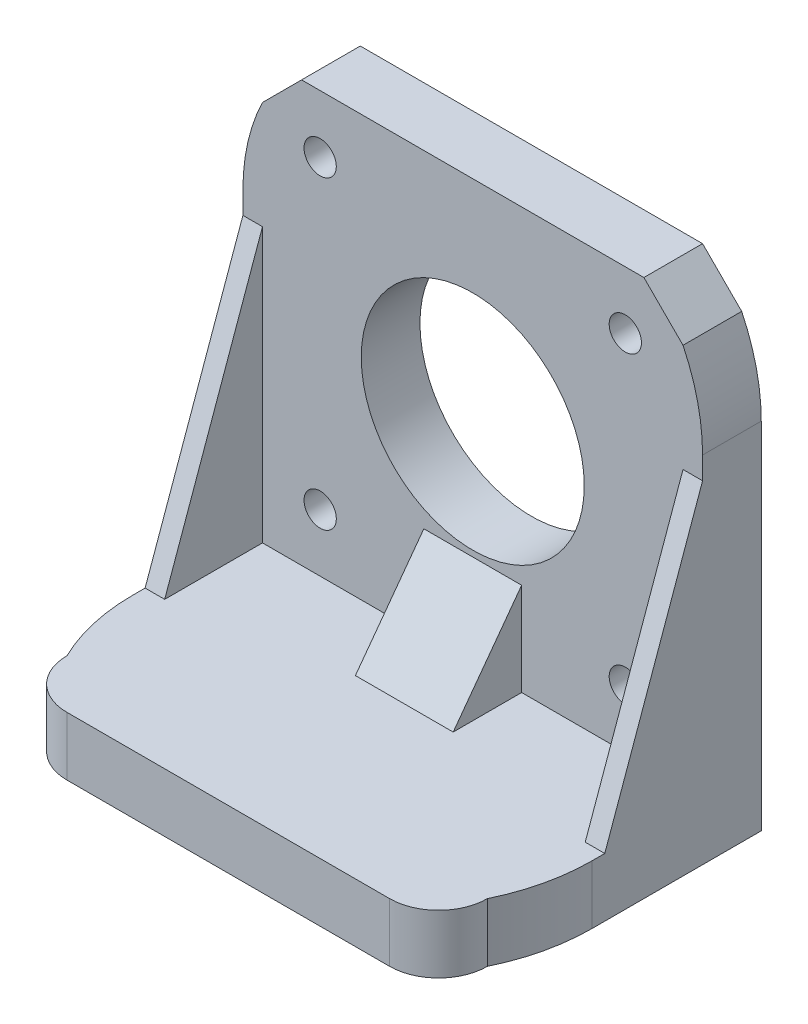
ISO-10303-21;
HEADER;
FILE_DESCRIPTION(('STEP AP214'),'2;1');
FILE_NAME('part.step','',(''),(''),'','','');
FILE_SCHEMA(('AUTOMOTIVE_DESIGN { 1 0 10303 214 1 1 1 1 }'));
ENDSEC;
DATA;
#1=APPLICATION_CONTEXT('core data for automotive mechanical design processes');
#2=APPLICATION_PROTOCOL_DEFINITION('international standard','automotive_design',2000,#1);
#3=PRODUCT_CONTEXT('',#1,'mechanical');
#4=PRODUCT('Part','Part','',(#3));
#5=PRODUCT_RELATED_PRODUCT_CATEGORY('part','',(#4));
#6=PRODUCT_DEFINITION_FORMATION('','',#4);
#7=PRODUCT_DEFINITION_CONTEXT('part definition',#1,'design');
#8=PRODUCT_DEFINITION('design','',#6,#7);
#9=PRODUCT_DEFINITION_SHAPE('','',#8);
#10=(LENGTH_UNIT() NAMED_UNIT(*) SI_UNIT(.MILLI.,.METRE.));
#11=(NAMED_UNIT(*) PLANE_ANGLE_UNIT() SI_UNIT($,.RADIAN.));
#12=(NAMED_UNIT(*) SI_UNIT($,.STERADIAN.) SOLID_ANGLE_UNIT());
#13=UNCERTAINTY_MEASURE_WITH_UNIT(LENGTH_MEASURE(1.E-05),#10,'distance_accuracy_value','');
#14=(GEOMETRIC_REPRESENTATION_CONTEXT(3) GLOBAL_UNCERTAINTY_ASSIGNED_CONTEXT((#13)) GLOBAL_UNIT_ASSIGNED_CONTEXT((#10,
#11,#12)) REPRESENTATION_CONTEXT('',''));
#15=CARTESIAN_POINT('',(0.,0.,0.));
#16=DIRECTION('',(0.,0.,1.));
#17=DIRECTION('',(1.,0.,0.));
#18=AXIS2_PLACEMENT_3D('',#15,#16,#17);
#19=CARTESIAN_POINT('',(0.,0.,6.));
#20=DIRECTION('',(0.,0.,-1.));
#21=DIRECTION('',(-1.,0.,0.));
#22=AXIS2_PLACEMENT_3D('',#19,#20,#21);
#23=PLANE('',#22);
#24=DIRECTION('',(-0.707106781186548,-0.707106781186548,0.));
#25=VECTOR('',#24,1.);
#26=CARTESIAN_POINT('',(-21.5,17.5,6.));
#27=LINE('',#26,#25);
#28=CARTESIAN_POINT('',(-17.5,21.5,6.));
#29=VERTEX_POINT('',#28);
#30=CARTESIAN_POINT('',(-21.5,17.5,6.));
#31=VERTEX_POINT('',#30);
#32=EDGE_CURVE('E326',#29,#31,#27,.T.);
#33=ORIENTED_EDGE('',*,*,#32,.T.);
#34=CARTESIAN_POINT('',(-3.5,8.78220211291863,6.));
#35=DIRECTION('',(0.,0.,-1.));
#36=DIRECTION('',(-1.,0.,0.));
#37=AXIS2_PLACEMENT_3D('',#34,#35,#36);
#38=CIRCLE('',#37,20.);
#39=CARTESIAN_POINT('',(-23.5,8.78220211291863,6.));
#40=VERTEX_POINT('',#39);
#41=EDGE_CURVE('E360',#31,#40,#38,.F.);
#42=ORIENTED_EDGE('',*,*,#41,.T.);
#43=DIRECTION('',(0.,-1.,0.));
#44=VECTOR('',#43,1.);
#45=CARTESIAN_POINT('',(-23.5,0.,6.));
#46=LINE('',#45,#44);
#47=CARTESIAN_POINT('',(-23.5,6.5,6.));
#48=VERTEX_POINT('',#47);
#49=EDGE_CURVE('E199',#40,#48,#46,.T.);
#50=ORIENTED_EDGE('',*,*,#49,.T.);
#51=DIRECTION('',(1.,0.,0.));
#52=VECTOR('',#51,1.);
#53=CARTESIAN_POINT('',(-23.5,6.5,6.));
#54=LINE('',#53,#52);
#55=CARTESIAN_POINT('',(-21.5,6.5,6.));
#56=VERTEX_POINT('',#55);
#57=EDGE_CURVE('E208',#48,#56,#54,.T.);
#58=ORIENTED_EDGE('',*,*,#57,.T.);
#59=DIRECTION('',(0.,1.,0.));
#60=VECTOR('',#59,1.);
#61=CARTESIAN_POINT('',(-21.5,0.,6.));
#62=LINE('',#61,#60);
#63=CARTESIAN_POINT('',(-21.5,-21.5,6.));
#64=VERTEX_POINT('',#63);
#65=EDGE_CURVE('E218',#64,#56,#62,.T.);
#66=ORIENTED_EDGE('',*,*,#65,.F.);
#67=DIRECTION('',(1.,0.,0.));
#68=VECTOR('',#67,1.);
#69=CARTESIAN_POINT('',(-21.5,-21.5,6.));
#70=LINE('',#69,#68);
#71=CARTESIAN_POINT('',(-5.,-21.5,6.));
#72=VERTEX_POINT('',#71);
#73=EDGE_CURVE('E315',#64,#72,#70,.T.);
#74=ORIENTED_EDGE('',*,*,#73,.T.);
#75=DIRECTION('',(0.,-1.,0.));
#76=VECTOR('',#75,1.);
#77=CARTESIAN_POINT('',(-5.,0.,6.));
#78=LINE('',#77,#76);
#79=CARTESIAN_POINT('',(-5.,-12.,6.));
#80=VERTEX_POINT('',#79);
#81=EDGE_CURVE('E248',#80,#72,#78,.T.);
#82=ORIENTED_EDGE('',*,*,#81,.F.);
#83=DIRECTION('',(1.,0.,0.));
#84=VECTOR('',#83,1.);
#85=CARTESIAN_POINT('',(0.,-12.,6.));
#86=LINE('',#85,#84);
#87=CARTESIAN_POINT('',(5.,-12.,6.));
#88=VERTEX_POINT('',#87);
#89=EDGE_CURVE('E257',#80,#88,#86,.T.);
#90=ORIENTED_EDGE('',*,*,#89,.T.);
#91=DIRECTION('',(0.,-1.,0.));
#92=VECTOR('',#91,1.);
#93=CARTESIAN_POINT('',(5.,0.,6.));
#94=LINE('',#93,#92);
#95=CARTESIAN_POINT('',(5.,-21.5,6.));
#96=VERTEX_POINT('',#95);
#97=EDGE_CURVE('E253',#88,#96,#94,.T.);
#98=ORIENTED_EDGE('',*,*,#97,.T.);
#99=CARTESIAN_POINT('',(21.5,-21.5,6.));
#100=VERTEX_POINT('',#99);
#101=EDGE_CURVE('E319',#96,#100,#70,.T.);
#102=ORIENTED_EDGE('',*,*,#101,.T.);
#103=DIRECTION('',(0.,1.,0.));
#104=VECTOR('',#103,1.);
#105=CARTESIAN_POINT('',(21.5,-21.5,6.));
#106=LINE('',#105,#104);
#107=CARTESIAN_POINT('',(21.5,6.5,6.));
#108=VERTEX_POINT('',#107);
#109=EDGE_CURVE('E318',#100,#108,#106,.T.);
#110=ORIENTED_EDGE('',*,*,#109,.T.);
#111=DIRECTION('',(-1.,0.,0.));
#112=VECTOR('',#111,1.);
#113=CARTESIAN_POINT('',(23.5,6.5,6.));
#114=LINE('',#113,#112);
#115=CARTESIAN_POINT('',(23.5,6.5,6.));
#116=VERTEX_POINT('',#115);
#117=EDGE_CURVE('E236',#116,#108,#114,.T.);
#118=ORIENTED_EDGE('',*,*,#117,.F.);
#119=DIRECTION('',(0.,-1.,0.));
#120=VECTOR('',#119,1.);
#121=CARTESIAN_POINT('',(23.5,0.,6.));
#122=LINE('',#121,#120);
#123=CARTESIAN_POINT('',(23.5,8.78220211291865,6.));
#124=VERTEX_POINT('',#123);
#125=EDGE_CURVE('E221',#124,#116,#122,.T.);
#126=ORIENTED_EDGE('',*,*,#125,.F.);
#127=CARTESIAN_POINT('',(3.5,8.78220211291865,6.));
#128=DIRECTION('',(0.,0.,-1.));
#129=DIRECTION('',(-1.,0.,0.));
#130=AXIS2_PLACEMENT_3D('',#127,#128,#129);
#131=CIRCLE('',#130,20.);
#132=CARTESIAN_POINT('',(21.5,17.5,6.));
#133=VERTEX_POINT('',#132);
#134=EDGE_CURVE('E352',#124,#133,#131,.F.);
#135=ORIENTED_EDGE('',*,*,#134,.T.);
#136=DIRECTION('',(-0.707106781186548,0.707106781186548,0.));
#137=VECTOR('',#136,1.);
#138=CARTESIAN_POINT('',(17.5,21.5,6.));
#139=LINE('',#138,#137);
#140=CARTESIAN_POINT('',(17.5,21.5,6.));
#141=VERTEX_POINT('',#140);
#142=EDGE_CURVE('E322',#133,#141,#139,.T.);
#143=ORIENTED_EDGE('',*,*,#142,.T.);
#144=DIRECTION('',(-1.,0.,0.));
#145=VECTOR('',#144,1.);
#146=CARTESIAN_POINT('',(-17.5,21.5,6.));
#147=LINE('',#146,#145);
#148=EDGE_CURVE('E324',#141,#29,#147,.T.);
#149=ORIENTED_EDGE('',*,*,#148,.T.);
#150=EDGE_LOOP('',(#33,#42,#50,#58,#66,#74,#82,#90,#98,#102,#110,#118,#126,#135,#143,#149));
#151=FACE_BOUND('',#150,.T.);
#152=CARTESIAN_POINT('',(-15.6,15.6,6.));
#153=DIRECTION('',(0.,0.,1.));
#154=DIRECTION('',(1.,0.,0.));
#155=AXIS2_PLACEMENT_3D('',#152,#153,#154);
#156=CIRCLE('',#155,1.65);
#157=CARTESIAN_POINT('',(-13.95,15.6,6.));
#158=VERTEX_POINT('',#157);
#159=EDGE_CURVE('E309',#158,#158,#156,.T.);
#160=ORIENTED_EDGE('',*,*,#159,.F.);
#161=EDGE_LOOP('',(#160));
#162=FACE_BOUND('',#161,.T.);
#163=CARTESIAN_POINT('',(-15.6,-15.6,6.));
#164=DIRECTION('',(0.,0.,1.));
#165=DIRECTION('',(1.,0.,0.));
#166=AXIS2_PLACEMENT_3D('',#163,#164,#165);
#167=CIRCLE('',#166,1.65);
#168=CARTESIAN_POINT('',(-13.95,-15.6,6.));
#169=VERTEX_POINT('',#168);
#170=EDGE_CURVE('E303',#169,#169,#167,.T.);
#171=ORIENTED_EDGE('',*,*,#170,.F.);
#172=EDGE_LOOP('',(#171));
#173=FACE_BOUND('',#172,.T.);
#174=CARTESIAN_POINT('',(15.6,-15.6,6.));
#175=DIRECTION('',(0.,0.,1.));
#176=DIRECTION('',(-1.,0.,0.));
#177=AXIS2_PLACEMENT_3D('',#174,#175,#176);
#178=CIRCLE('',#177,1.65);
#179=CARTESIAN_POINT('',(13.95,-15.6,6.));
#180=VERTEX_POINT('',#179);
#181=EDGE_CURVE('E297',#180,#180,#178,.T.);
#182=ORIENTED_EDGE('',*,*,#181,.F.);
#183=EDGE_LOOP('',(#182));
#184=FACE_BOUND('',#183,.T.);
#185=CARTESIAN_POINT('',(15.6,15.6,6.));
#186=DIRECTION('',(0.,0.,1.));
#187=DIRECTION('',(-1.,0.,0.));
#188=AXIS2_PLACEMENT_3D('',#185,#186,#187);
#189=CIRCLE('',#188,1.65);
#190=CARTESIAN_POINT('',(13.95,15.6,6.));
#191=VERTEX_POINT('',#190);
#192=EDGE_CURVE('E291',#191,#191,#189,.T.);
#193=ORIENTED_EDGE('',*,*,#192,.F.);
#194=EDGE_LOOP('',(#193));
#195=FACE_BOUND('',#194,.T.);
#196=CARTESIAN_POINT('',(0.,0.,6.));
#197=DIRECTION('',(0.,0.,1.));
#198=DIRECTION('',(1.,0.,0.));
#199=AXIS2_PLACEMENT_3D('',#196,#197,#198);
#200=CIRCLE('',#199,11.4);
#201=CARTESIAN_POINT('',(11.4,0.,6.));
#202=VERTEX_POINT('',#201);
#203=EDGE_CURVE('E285',#202,#202,#200,.T.);
#204=ORIENTED_EDGE('',*,*,#203,.F.);
#205=EDGE_LOOP('',(#204));
#206=FACE_BOUND('',#205,.T.);
#207=ADVANCED_FACE('F35',(#151,#162,#173,#184,#195,#206),#23,.F.);
#208=CARTESIAN_POINT('',(0.,0.,0.));
#209=DIRECTION('',(0.,0.,-1.));
#210=DIRECTION('',(-1.,0.,0.));
#211=AXIS2_PLACEMENT_3D('',#208,#209,#210);
#212=PLANE('',#211);
#213=DIRECTION('',(0.,1.,0.));
#214=VECTOR('',#213,1.);
#215=CARTESIAN_POINT('',(-23.5,0.,0.));
#216=LINE('',#215,#214);
#217=CARTESIAN_POINT('',(-23.5,-27.5,0.));
#218=VERTEX_POINT('',#217);
#219=CARTESIAN_POINT('',(-23.5,8.78220211291863,0.));
#220=VERTEX_POINT('',#219);
#221=EDGE_CURVE('E183',#218,#220,#216,.T.);
#222=ORIENTED_EDGE('',*,*,#221,.T.);
#223=CARTESIAN_POINT('',(-3.5,8.78220211291863,0.));
#224=DIRECTION('',(0.,0.,-1.));
#225=DIRECTION('',(-1.,0.,0.));
#226=AXIS2_PLACEMENT_3D('',#223,#224,#225);
#227=CIRCLE('',#226,20.);
#228=CARTESIAN_POINT('',(-21.5,17.5,0.));
#229=VERTEX_POINT('',#228);
#230=EDGE_CURVE('E364',#220,#229,#227,.T.);
#231=ORIENTED_EDGE('',*,*,#230,.T.);
#232=DIRECTION('',(-0.707106781186548,-0.707106781186548,0.));
#233=VECTOR('',#232,1.);
#234=CARTESIAN_POINT('',(-21.5,17.5,0.));
#235=LINE('',#234,#233);
#236=CARTESIAN_POINT('',(-17.5,21.5,0.));
#237=VERTEX_POINT('',#236);
#238=EDGE_CURVE('E333',#237,#229,#235,.T.);
#239=ORIENTED_EDGE('',*,*,#238,.F.);
#240=DIRECTION('',(-1.,0.,0.));
#241=VECTOR('',#240,1.);
#242=CARTESIAN_POINT('',(-17.5,21.5,0.));
#243=LINE('',#242,#241);
#244=CARTESIAN_POINT('',(17.5,21.5,0.));
#245=VERTEX_POINT('',#244);
#246=EDGE_CURVE('E331',#245,#237,#243,.T.);
#247=ORIENTED_EDGE('',*,*,#246,.F.);
#248=DIRECTION('',(-0.707106781186548,0.707106781186548,0.));
#249=VECTOR('',#248,1.);
#250=CARTESIAN_POINT('',(17.5,21.5,0.));
#251=LINE('',#250,#249);
#252=CARTESIAN_POINT('',(21.5,17.5,0.));
#253=VERTEX_POINT('',#252);
#254=EDGE_CURVE('E312',#253,#245,#251,.T.);
#255=ORIENTED_EDGE('',*,*,#254,.F.);
#256=CARTESIAN_POINT('',(3.5,8.78220211291865,0.));
#257=DIRECTION('',(0.,0.,-1.));
#258=DIRECTION('',(-1.,0.,0.));
#259=AXIS2_PLACEMENT_3D('',#256,#257,#258);
#260=CIRCLE('',#259,20.);
#261=CARTESIAN_POINT('',(23.5,8.78220211291865,0.));
#262=VERTEX_POINT('',#261);
#263=EDGE_CURVE('E354',#253,#262,#260,.T.);
#264=ORIENTED_EDGE('',*,*,#263,.T.);
#265=DIRECTION('',(0.,1.,0.));
#266=VECTOR('',#265,1.);
#267=CARTESIAN_POINT('',(23.5,0.,0.));
#268=LINE('',#267,#266);
#269=CARTESIAN_POINT('',(23.5,-27.5,0.));
#270=VERTEX_POINT('',#269);
#271=EDGE_CURVE('E191',#270,#262,#268,.T.);
#272=ORIENTED_EDGE('',*,*,#271,.F.);
#273=DIRECTION('',(1.,0.,0.));
#274=VECTOR('',#273,1.);
#275=CARTESIAN_POINT('',(-21.5,-27.5,0.));
#276=LINE('',#275,#274);
#277=EDGE_CURVE('E179',#218,#270,#276,.T.);
#278=ORIENTED_EDGE('',*,*,#277,.F.);
#279=EDGE_LOOP('',(#222,#231,#239,#247,#255,#264,#272,#278));
#280=FACE_BOUND('',#279,.T.);
#281=CARTESIAN_POINT('',(0.,0.,0.));
#282=DIRECTION('',(0.,0.,1.));
#283=DIRECTION('',(1.,0.,0.));
#284=AXIS2_PLACEMENT_3D('',#281,#282,#283);
#285=CIRCLE('',#284,11.4);
#286=CARTESIAN_POINT('',(11.4,0.,0.));
#287=VERTEX_POINT('',#286);
#288=EDGE_CURVE('E284',#287,#287,#285,.T.);
#289=ORIENTED_EDGE('',*,*,#288,.T.);
#290=EDGE_LOOP('',(#289));
#291=FACE_BOUND('',#290,.T.);
#292=CARTESIAN_POINT('',(15.6,15.6,0.));
#293=DIRECTION('',(0.,0.,1.));
#294=DIRECTION('',(-1.,0.,0.));
#295=AXIS2_PLACEMENT_3D('',#292,#293,#294);
#296=CIRCLE('',#295,1.65);
#297=CARTESIAN_POINT('',(13.95,15.6,0.));
#298=VERTEX_POINT('',#297);
#299=EDGE_CURVE('E288',#298,#298,#296,.T.);
#300=ORIENTED_EDGE('',*,*,#299,.T.);
#301=EDGE_LOOP('',(#300));
#302=FACE_BOUND('',#301,.T.);
#303=CARTESIAN_POINT('',(-15.6,-15.6,0.));
#304=DIRECTION('',(0.,0.,1.));
#305=DIRECTION('',(1.,0.,0.));
#306=AXIS2_PLACEMENT_3D('',#303,#304,#305);
#307=CIRCLE('',#306,1.65);
#308=CARTESIAN_POINT('',(-13.95,-15.6,0.));
#309=VERTEX_POINT('',#308);
#310=EDGE_CURVE('E300',#309,#309,#307,.T.);
#311=ORIENTED_EDGE('',*,*,#310,.T.);
#312=EDGE_LOOP('',(#311));
#313=FACE_BOUND('',#312,.T.);
#314=CARTESIAN_POINT('',(-15.6,15.6,0.));
#315=DIRECTION('',(0.,0.,1.));
#316=DIRECTION('',(1.,0.,0.));
#317=AXIS2_PLACEMENT_3D('',#314,#315,#316);
#318=CIRCLE('',#317,1.65);
#319=CARTESIAN_POINT('',(-13.95,15.6,0.));
#320=VERTEX_POINT('',#319);
#321=EDGE_CURVE('E306',#320,#320,#318,.T.);
#322=ORIENTED_EDGE('',*,*,#321,.T.);
#323=EDGE_LOOP('',(#322));
#324=FACE_BOUND('',#323,.T.);
#325=CARTESIAN_POINT('',(15.6,-15.6,0.));
#326=DIRECTION('',(0.,0.,1.));
#327=DIRECTION('',(-1.,0.,0.));
#328=AXIS2_PLACEMENT_3D('',#325,#326,#327);
#329=CIRCLE('',#328,1.65);
#330=CARTESIAN_POINT('',(13.95,-15.6,0.));
#331=VERTEX_POINT('',#330);
#332=EDGE_CURVE('E294',#331,#331,#329,.T.);
#333=ORIENTED_EDGE('',*,*,#332,.T.);
#334=EDGE_LOOP('',(#333));
#335=FACE_BOUND('',#334,.T.);
#336=ADVANCED_FACE('F187',(#280,#291,#302,#313,#324,#335),#212,.T.);
#337=CARTESIAN_POINT('',(17.5,21.5,6.));
#338=DIRECTION('',(-0.707106781186547,-0.707106781186547,0.));
#339=DIRECTION('',(0.707106781186548,-0.707106781186548,0.));
#340=AXIS2_PLACEMENT_3D('',#337,#338,#339);
#341=PLANE('',#340);
#342=ORIENTED_EDGE('',*,*,#254,.T.);
#343=DIRECTION('',(0.,0.,-1.));
#344=VECTOR('',#343,1.);
#345=CARTESIAN_POINT('',(17.5,21.5,6.));
#346=LINE('',#345,#344);
#347=EDGE_CURVE('E341',#141,#245,#346,.T.);
#348=ORIENTED_EDGE('',*,*,#347,.F.);
#349=ORIENTED_EDGE('',*,*,#142,.F.);
#350=DIRECTION('',(0.,0.,-1.));
#351=VECTOR('',#350,1.);
#352=CARTESIAN_POINT('',(21.5,17.5,6.));
#353=LINE('',#352,#351);
#354=EDGE_CURVE('E344',#133,#253,#353,.T.);
#355=ORIENTED_EDGE('',*,*,#354,.T.);
#356=EDGE_LOOP('',(#342,#348,#349,#355));
#357=FACE_BOUND('',#356,.T.);
#358=ADVANCED_FACE('F459',(#357),#341,.F.);
#359=CARTESIAN_POINT('',(-17.5,21.5,6.));
#360=DIRECTION('',(0.,-1.,0.));
#361=DIRECTION('',(0.,0.,-1.));
#362=AXIS2_PLACEMENT_3D('',#359,#360,#361);
#363=PLANE('',#362);
#364=ORIENTED_EDGE('',*,*,#246,.T.);
#365=DIRECTION('',(0.,0.,-1.));
#366=VECTOR('',#365,1.);
#367=CARTESIAN_POINT('',(-17.5,21.5,6.));
#368=LINE('',#367,#366);
#369=EDGE_CURVE('E338',#29,#237,#368,.T.);
#370=ORIENTED_EDGE('',*,*,#369,.F.);
#371=ORIENTED_EDGE('',*,*,#148,.F.);
#372=ORIENTED_EDGE('',*,*,#347,.T.);
#373=EDGE_LOOP('',(#364,#370,#371,#372));
#374=FACE_BOUND('',#373,.T.);
#375=ADVANCED_FACE('F380',(#374),#363,.F.);
#376=CARTESIAN_POINT('',(-21.5,17.5,6.));
#377=DIRECTION('',(0.707106781186547,-0.707106781186547,0.));
#378=DIRECTION('',(0.707106781186548,0.707106781186548,0.));
#379=AXIS2_PLACEMENT_3D('',#376,#377,#378);
#380=PLANE('',#379);
#381=ORIENTED_EDGE('',*,*,#238,.T.);
#382=DIRECTION('',(0.,0.,-1.));
#383=VECTOR('',#382,1.);
#384=CARTESIAN_POINT('',(-21.5,17.5,6.));
#385=LINE('',#384,#383);
#386=EDGE_CURVE('E329',#31,#229,#385,.T.);
#387=ORIENTED_EDGE('',*,*,#386,.F.);
#388=ORIENTED_EDGE('',*,*,#32,.F.);
#389=ORIENTED_EDGE('',*,*,#369,.T.);
#390=EDGE_LOOP('',(#381,#387,#388,#389));
#391=FACE_BOUND('',#390,.T.);
#392=ADVANCED_FACE('F370',(#391),#380,.F.);
#393=CARTESIAN_POINT('',(-15.6,15.6,6.));
#394=DIRECTION('',(0.,0.,-1.));
#395=DIRECTION('',(-1.,0.,0.));
#396=AXIS2_PLACEMENT_3D('',#393,#394,#395);
#397=CYLINDRICAL_SURFACE('',#396,1.65);
#398=ORIENTED_EDGE('',*,*,#159,.T.);
#399=EDGE_LOOP('',(#398));
#400=FACE_BOUND('',#399,.T.);
#401=ORIENTED_EDGE('',*,*,#321,.F.);
#402=EDGE_LOOP('',(#401));
#403=FACE_BOUND('',#402,.T.);
#404=ADVANCED_FACE('F462',(#400,#403),#397,.F.);
#405=CARTESIAN_POINT('',(-15.6,-15.6,6.));
#406=DIRECTION('',(0.,0.,-1.));
#407=DIRECTION('',(-1.,0.,0.));
#408=AXIS2_PLACEMENT_3D('',#405,#406,#407);
#409=CYLINDRICAL_SURFACE('',#408,1.65);
#410=ORIENTED_EDGE('',*,*,#170,.T.);
#411=EDGE_LOOP('',(#410));
#412=FACE_BOUND('',#411,.T.);
#413=ORIENTED_EDGE('',*,*,#310,.F.);
#414=EDGE_LOOP('',(#413));
#415=FACE_BOUND('',#414,.T.);
#416=ADVANCED_FACE('F717',(#412,#415),#409,.F.);
#417=CARTESIAN_POINT('',(15.6,-15.6,6.));
#418=DIRECTION('',(0.,0.,-1.));
#419=DIRECTION('',(-1.,0.,0.));
#420=AXIS2_PLACEMENT_3D('',#417,#418,#419);
#421=CYLINDRICAL_SURFACE('',#420,1.65);
#422=ORIENTED_EDGE('',*,*,#181,.T.);
#423=EDGE_LOOP('',(#422));
#424=FACE_BOUND('',#423,.T.);
#425=ORIENTED_EDGE('',*,*,#332,.F.);
#426=EDGE_LOOP('',(#425));
#427=FACE_BOUND('',#426,.T.);
#428=ADVANCED_FACE('F714',(#424,#427),#421,.F.);
#429=CARTESIAN_POINT('',(15.6,15.6,6.));
#430=DIRECTION('',(0.,0.,-1.));
#431=DIRECTION('',(-1.,0.,0.));
#432=AXIS2_PLACEMENT_3D('',#429,#430,#431);
#433=CYLINDRICAL_SURFACE('',#432,1.65);
#434=ORIENTED_EDGE('',*,*,#192,.T.);
#435=EDGE_LOOP('',(#434));
#436=FACE_BOUND('',#435,.T.);
#437=ORIENTED_EDGE('',*,*,#299,.F.);
#438=EDGE_LOOP('',(#437));
#439=FACE_BOUND('',#438,.T.);
#440=ADVANCED_FACE('F669',(#436,#439),#433,.F.);
#441=CARTESIAN_POINT('',(0.,0.,6.));
#442=DIRECTION('',(0.,0.,-1.));
#443=DIRECTION('',(-1.,0.,0.));
#444=AXIS2_PLACEMENT_3D('',#441,#442,#443);
#445=CYLINDRICAL_SURFACE('',#444,11.4);
#446=ORIENTED_EDGE('',*,*,#288,.F.);
#447=EDGE_LOOP('',(#446));
#448=FACE_BOUND('',#447,.T.);
#449=ORIENTED_EDGE('',*,*,#203,.T.);
#450=EDGE_LOOP('',(#449));
#451=FACE_BOUND('',#450,.T.);
#452=ADVANCED_FACE('F564',(#448,#451),#445,.F.);
#453=CARTESIAN_POINT('',(-16.5,-21.5,26.));
#454=DIRECTION('',(0.,1.,0.));
#455=DIRECTION('',(0.,0.,1.));
#456=AXIS2_PLACEMENT_3D('',#453,#454,#455);
#457=PLANE('',#456);
#458=DIRECTION('',(0.,0.,1.));
#459=VECTOR('',#458,1.);
#460=CARTESIAN_POINT('',(-23.5,-21.5,0.));
#461=LINE('',#460,#459);
#462=CARTESIAN_POINT('',(-23.5,-21.5,16.));
#463=VERTEX_POINT('',#462);
#464=CARTESIAN_POINT('',(-23.5,-21.5,17.2822021129186));
#465=VERTEX_POINT('',#464);
#466=EDGE_CURVE('E182',#463,#465,#461,.T.);
#467=ORIENTED_EDGE('',*,*,#466,.T.);
#468=CARTESIAN_POINT('',(-3.5,-21.5,17.2822021129186));
#469=DIRECTION('',(0.,1.,0.));
#470=DIRECTION('',(0.,0.,1.));
#471=AXIS2_PLACEMENT_3D('',#468,#469,#470);
#472=CIRCLE('',#471,20.);
#473=CARTESIAN_POINT('',(-21.5,-21.5,26.));
#474=VERTEX_POINT('',#473);
#475=EDGE_CURVE('E11',#465,#474,#472,.T.);
#476=ORIENTED_EDGE('',*,*,#475,.T.);
#477=CARTESIAN_POINT('',(-16.5,-21.5,26.));
#478=DIRECTION('',(0.,-1.,0.));
#479=DIRECTION('',(0.,0.,1.));
#480=AXIS2_PLACEMENT_3D('',#477,#478,#479);
#481=CIRCLE('',#480,5.);
#482=CARTESIAN_POINT('',(-16.5,-21.5,31.));
#483=VERTEX_POINT('',#482);
#484=EDGE_CURVE('E193',#483,#474,#481,.T.);
#485=ORIENTED_EDGE('',*,*,#484,.F.);
#486=DIRECTION('',(-1.,0.,0.));
#487=VECTOR('',#486,1.);
#488=CARTESIAN_POINT('',(-16.5,-21.5,31.));
#489=LINE('',#488,#487);
#490=CARTESIAN_POINT('',(16.5,-21.5,31.));
#491=VERTEX_POINT('',#490);
#492=EDGE_CURVE('E270',#491,#483,#489,.T.);
#493=ORIENTED_EDGE('',*,*,#492,.F.);
#494=CARTESIAN_POINT('',(16.5,-21.5,26.));
#495=DIRECTION('',(0.,-1.,0.));
#496=DIRECTION('',(0.,0.,1.));
#497=AXIS2_PLACEMENT_3D('',#494,#495,#496);
#498=CIRCLE('',#497,5.);
#499=CARTESIAN_POINT('',(21.5,-21.5,26.));
#500=VERTEX_POINT('',#499);
#501=EDGE_CURVE('E268',#500,#491,#498,.T.);
#502=ORIENTED_EDGE('',*,*,#501,.F.);
#503=CARTESIAN_POINT('',(3.5,-21.5,17.2822021129186));
#504=DIRECTION('',(0.,1.,0.));
#505=DIRECTION('',(0.,0.,1.));
#506=AXIS2_PLACEMENT_3D('',#503,#504,#505);
#507=CIRCLE('',#506,20.);
#508=CARTESIAN_POINT('',(23.5,-21.5,17.2822021129186));
#509=VERTEX_POINT('',#508);
#510=EDGE_CURVE('E358',#500,#509,#507,.T.);
#511=ORIENTED_EDGE('',*,*,#510,.T.);
#512=DIRECTION('',(0.,0.,1.));
#513=VECTOR('',#512,1.);
#514=CARTESIAN_POINT('',(23.5,-21.5,0.));
#515=LINE('',#514,#513);
#516=CARTESIAN_POINT('',(23.5,-21.5,16.));
#517=VERTEX_POINT('',#516);
#518=EDGE_CURVE('E225',#517,#509,#515,.T.);
#519=ORIENTED_EDGE('',*,*,#518,.F.);
#520=DIRECTION('',(-1.,0.,0.));
#521=VECTOR('',#520,1.);
#522=CARTESIAN_POINT('',(23.5,-21.5,16.));
#523=LINE('',#522,#521);
#524=CARTESIAN_POINT('',(21.5,-21.5,16.));
#525=VERTEX_POINT('',#524);
#526=EDGE_CURVE('E231',#517,#525,#523,.T.);
#527=ORIENTED_EDGE('',*,*,#526,.T.);
#528=DIRECTION('',(0.,0.,1.));
#529=VECTOR('',#528,1.);
#530=CARTESIAN_POINT('',(21.5,-21.5,0.));
#531=LINE('',#530,#529);
#532=EDGE_CURVE('E259',#100,#525,#531,.T.);
#533=ORIENTED_EDGE('',*,*,#532,.F.);
#534=ORIENTED_EDGE('',*,*,#101,.F.);
#535=DIRECTION('',(0.,0.,-1.));
#536=VECTOR('',#535,1.);
#537=CARTESIAN_POINT('',(5.,-21.5,26.));
#538=LINE('',#537,#536);
#539=CARTESIAN_POINT('',(5.,-21.5,13.));
#540=VERTEX_POINT('',#539);
#541=EDGE_CURVE('E250',#540,#96,#538,.T.);
#542=ORIENTED_EDGE('',*,*,#541,.F.);
#543=DIRECTION('',(1.,0.,0.));
#544=VECTOR('',#543,1.);
#545=CARTESIAN_POINT('',(-16.5,-21.5,13.));
#546=LINE('',#545,#544);
#547=CARTESIAN_POINT('',(-5.,-21.5,13.));
#548=VERTEX_POINT('',#547);
#549=EDGE_CURVE('E255',#548,#540,#546,.T.);
#550=ORIENTED_EDGE('',*,*,#549,.F.);
#551=DIRECTION('',(0.,0.,-1.));
#552=VECTOR('',#551,1.);
#553=CARTESIAN_POINT('',(-5.,-21.5,26.));
#554=LINE('',#553,#552);
#555=EDGE_CURVE('E243',#548,#72,#554,.T.);
#556=ORIENTED_EDGE('',*,*,#555,.T.);
#557=ORIENTED_EDGE('',*,*,#73,.F.);
#558=DIRECTION('',(0.,0.,1.));
#559=VECTOR('',#558,1.);
#560=CARTESIAN_POINT('',(-21.5,-21.5,26.));
#561=LINE('',#560,#559);
#562=CARTESIAN_POINT('',(-21.5,-21.5,16.));
#563=VERTEX_POINT('',#562);
#564=EDGE_CURVE('E215',#64,#563,#561,.T.);
#565=ORIENTED_EDGE('',*,*,#564,.T.);
#566=DIRECTION('',(1.,0.,0.));
#567=VECTOR('',#566,1.);
#568=CARTESIAN_POINT('',(-23.5,-21.5,16.));
#569=LINE('',#568,#567);
#570=EDGE_CURVE('E213',#463,#563,#569,.T.);
#571=ORIENTED_EDGE('',*,*,#570,.F.);
#572=EDGE_LOOP('',(#467,#476,#485,#493,#502,#511,#519,#527,#533,#534,#542,#550,#556,#557,#565,#571));
#573=FACE_BOUND('',#572,.T.);
#574=ADVANCED_FACE('F421',(#573),#457,.T.);
#575=CARTESIAN_POINT('',(16.5,-27.5,26.));
#576=DIRECTION('',(0.,1.,0.));
#577=DIRECTION('',(0.,0.,1.));
#578=AXIS2_PLACEMENT_3D('',#575,#576,#577);
#579=CYLINDRICAL_SURFACE('',#578,5.);
#580=ORIENTED_EDGE('',*,*,#501,.T.);
#581=DIRECTION('',(0.,1.,0.));
#582=VECTOR('',#581,1.);
#583=CARTESIAN_POINT('',(16.5,-27.5,31.));
#584=LINE('',#583,#582);
#585=CARTESIAN_POINT('',(16.5,-27.5,31.));
#586=VERTEX_POINT('',#585);
#587=EDGE_CURVE('E279',#586,#491,#584,.T.);
#588=ORIENTED_EDGE('',*,*,#587,.F.);
#589=CARTESIAN_POINT('',(16.5,-27.5,26.));
#590=DIRECTION('',(0.,-1.,0.));
#591=DIRECTION('',(0.,0.,1.));
#592=AXIS2_PLACEMENT_3D('',#589,#590,#591);
#593=CIRCLE('',#592,5.);
#594=CARTESIAN_POINT('',(21.5,-27.5,26.));
#595=VERTEX_POINT('',#594);
#596=EDGE_CURVE('E192',#595,#586,#593,.T.);
#597=ORIENTED_EDGE('',*,*,#596,.F.);
#598=DIRECTION('',(0.,1.,0.));
#599=VECTOR('',#598,1.);
#600=CARTESIAN_POINT('',(21.5,-27.5,26.));
#601=LINE('',#600,#599);
#602=EDGE_CURVE('E282',#595,#500,#601,.T.);
#603=ORIENTED_EDGE('',*,*,#602,.T.);
#604=EDGE_LOOP('',(#580,#588,#597,#603));
#605=FACE_BOUND('',#604,.T.);
#606=ADVANCED_FACE('F407',(#605),#579,.T.);
#607=CARTESIAN_POINT('',(-16.5,-27.5,31.));
#608=DIRECTION('',(0.,0.,-1.));
#609=DIRECTION('',(-1.,0.,0.));
#610=AXIS2_PLACEMENT_3D('',#607,#608,#609);
#611=PLANE('',#610);
#612=ORIENTED_EDGE('',*,*,#492,.T.);
#613=DIRECTION('',(0.,1.,0.));
#614=VECTOR('',#613,1.);
#615=CARTESIAN_POINT('',(-16.5,-27.5,31.));
#616=LINE('',#615,#614);
#617=CARTESIAN_POINT('',(-16.5,-27.5,31.));
#618=VERTEX_POINT('',#617);
#619=EDGE_CURVE('E276',#618,#483,#616,.T.);
#620=ORIENTED_EDGE('',*,*,#619,.F.);
#621=DIRECTION('',(-1.,0.,0.));
#622=VECTOR('',#621,1.);
#623=CARTESIAN_POINT('',(-16.5,-27.5,31.));
#624=LINE('',#623,#622);
#625=EDGE_CURVE('E262',#586,#618,#624,.T.);
#626=ORIENTED_EDGE('',*,*,#625,.F.);
#627=ORIENTED_EDGE('',*,*,#587,.T.);
#628=EDGE_LOOP('',(#612,#620,#626,#627));
#629=FACE_BOUND('',#628,.T.);
#630=ADVANCED_FACE('F413',(#629),#611,.F.);
#631=CARTESIAN_POINT('',(-16.5,-27.5,26.));
#632=DIRECTION('',(0.,1.,0.));
#633=DIRECTION('',(0.,0.,1.));
#634=AXIS2_PLACEMENT_3D('',#631,#632,#633);
#635=CYLINDRICAL_SURFACE('',#634,5.);
#636=ORIENTED_EDGE('',*,*,#484,.T.);
#637=DIRECTION('',(0.,1.,0.));
#638=VECTOR('',#637,1.);
#639=CARTESIAN_POINT('',(-21.5,-27.5,26.));
#640=LINE('',#639,#638);
#641=CARTESIAN_POINT('',(-21.5,-27.5,26.));
#642=VERTEX_POINT('',#641);
#643=EDGE_CURVE('E266',#642,#474,#640,.T.);
#644=ORIENTED_EDGE('',*,*,#643,.F.);
#645=CARTESIAN_POINT('',(-16.5,-27.5,26.));
#646=DIRECTION('',(0.,-1.,0.));
#647=DIRECTION('',(0.,0.,1.));
#648=AXIS2_PLACEMENT_3D('',#645,#646,#647);
#649=CIRCLE('',#648,5.);
#650=EDGE_CURVE('E264',#618,#642,#649,.T.);
#651=ORIENTED_EDGE('',*,*,#650,.F.);
#652=ORIENTED_EDGE('',*,*,#619,.T.);
#653=EDGE_LOOP('',(#636,#644,#651,#652));
#654=FACE_BOUND('',#653,.T.);
#655=ADVANCED_FACE('F417',(#654),#635,.T.);
#656=CARTESIAN_POINT('',(-16.5,-27.5,26.));
#657=DIRECTION('',(0.,1.,0.));
#658=DIRECTION('',(0.,0.,1.));
#659=AXIS2_PLACEMENT_3D('',#656,#657,#658);
#660=PLANE('',#659);
#661=ORIENTED_EDGE('',*,*,#650,.T.);
#662=CARTESIAN_POINT('',(-3.5,-27.5,17.2822021129186));
#663=DIRECTION('',(0.,1.,0.));
#664=DIRECTION('',(0.,0.,1.));
#665=AXIS2_PLACEMENT_3D('',#662,#663,#664);
#666=CIRCLE('',#665,20.);
#667=CARTESIAN_POINT('',(-23.5,-27.5,17.2822021129186));
#668=VERTEX_POINT('',#667);
#669=EDGE_CURVE('E43',#642,#668,#666,.F.);
#670=ORIENTED_EDGE('',*,*,#669,.T.);
#671=DIRECTION('',(0.,0.,-1.));
#672=VECTOR('',#671,1.);
#673=CARTESIAN_POINT('',(-23.5,-27.5,0.));
#674=LINE('',#673,#672);
#675=EDGE_CURVE('E175',#668,#218,#674,.T.);
#676=ORIENTED_EDGE('',*,*,#675,.T.);
#677=ORIENTED_EDGE('',*,*,#277,.T.);
#678=DIRECTION('',(0.,0.,-1.));
#679=VECTOR('',#678,1.);
#680=CARTESIAN_POINT('',(23.5,-27.5,0.));
#681=LINE('',#680,#679);
#682=CARTESIAN_POINT('',(23.5,-27.5,17.2822021129186));
#683=VERTEX_POINT('',#682);
#684=EDGE_CURVE('E228',#683,#270,#681,.T.);
#685=ORIENTED_EDGE('',*,*,#684,.F.);
#686=CARTESIAN_POINT('',(3.5,-27.5,17.2822021129186));
#687=DIRECTION('',(0.,1.,0.));
#688=DIRECTION('',(0.,0.,1.));
#689=AXIS2_PLACEMENT_3D('',#686,#687,#688);
#690=CIRCLE('',#689,20.);
#691=EDGE_CURVE('E356',#683,#595,#690,.F.);
#692=ORIENTED_EDGE('',*,*,#691,.T.);
#693=ORIENTED_EDGE('',*,*,#596,.T.);
#694=ORIENTED_EDGE('',*,*,#625,.T.);
#695=EDGE_LOOP('',(#661,#670,#676,#677,#685,#692,#693,#694));
#696=FACE_BOUND('',#695,.T.);
#697=ADVANCED_FACE('F177',(#696),#660,.F.);
#698=CARTESIAN_POINT('',(0.,-12.,6.));
#699=DIRECTION('',(0.,0.59319903804985,0.805055837353368));
#700=DIRECTION('',(0.,-0.805055837353368,0.59319903804985));
#701=AXIS2_PLACEMENT_3D('',#698,#699,#700);
#702=PLANE('',#701);
#703=ORIENTED_EDGE('',*,*,#89,.F.);
#704=DIRECTION('',(0.,-0.805055837353368,0.59319903804985));
#705=VECTOR('',#704,1.);
#706=CARTESIAN_POINT('',(-5.,-12.,6.));
#707=LINE('',#706,#705);
#708=EDGE_CURVE('E239',#80,#548,#707,.T.);
#709=ORIENTED_EDGE('',*,*,#708,.T.);
#710=ORIENTED_EDGE('',*,*,#549,.T.);
#711=DIRECTION('',(0.,-0.805055837353368,0.59319903804985));
#712=VECTOR('',#711,1.);
#713=CARTESIAN_POINT('',(5.,-12.,6.));
#714=LINE('',#713,#712);
#715=EDGE_CURVE('E240',#88,#540,#714,.T.);
#716=ORIENTED_EDGE('',*,*,#715,.F.);
#717=EDGE_LOOP('',(#703,#709,#710,#716));
#718=FACE_BOUND('',#717,.T.);
#719=ADVANCED_FACE('F437',(#718),#702,.T.);
#720=CARTESIAN_POINT('',(5.,-3.,15.5));
#721=DIRECTION('',(1.,0.,0.));
#722=DIRECTION('',(0.,0.,-1.));
#723=AXIS2_PLACEMENT_3D('',#720,#721,#722);
#724=PLANE('',#723);
#725=ORIENTED_EDGE('',*,*,#541,.T.);
#726=ORIENTED_EDGE('',*,*,#97,.F.);
#727=ORIENTED_EDGE('',*,*,#715,.T.);
#728=EDGE_LOOP('',(#725,#726,#727));
#729=FACE_BOUND('',#728,.T.);
#730=ADVANCED_FACE('F442',(#729),#724,.T.);
#731=CARTESIAN_POINT('',(-5.,-3.,15.5));
#732=DIRECTION('',(1.,0.,0.));
#733=DIRECTION('',(0.,0.,-1.));
#734=AXIS2_PLACEMENT_3D('',#731,#732,#733);
#735=PLANE('',#734);
#736=ORIENTED_EDGE('',*,*,#708,.F.);
#737=ORIENTED_EDGE('',*,*,#81,.T.);
#738=ORIENTED_EDGE('',*,*,#555,.F.);
#739=EDGE_LOOP('',(#736,#737,#738));
#740=FACE_BOUND('',#739,.T.);
#741=ADVANCED_FACE('F435',(#740),#735,.F.);
#742=CARTESIAN_POINT('',(21.5,0.,0.));
#743=DIRECTION('',(1.,0.,0.));
#744=DIRECTION('',(0.,0.,-1.));
#745=AXIS2_PLACEMENT_3D('',#742,#743,#744);
#746=PLANE('',#745);
#747=DIRECTION('',(0.,-0.941741911594838,0.336336396998156));
#748=VECTOR('',#747,1.);
#749=CARTESIAN_POINT('',(21.5,2.63574660633484,7.38009049773756));
#750=LINE('',#749,#748);
#751=EDGE_CURVE('E220',#108,#525,#750,.T.);
#752=ORIENTED_EDGE('',*,*,#751,.F.);
#753=ORIENTED_EDGE('',*,*,#109,.F.);
#754=ORIENTED_EDGE('',*,*,#532,.T.);
#755=EDGE_LOOP('',(#752,#753,#754));
#756=FACE_BOUND('',#755,.T.);
#757=ADVANCED_FACE('F444',(#756),#746,.F.);
#758=CARTESIAN_POINT('',(23.5,2.63574660633484,7.38009049773756));
#759=DIRECTION('',(0.,-0.336336396998156,-0.941741911594838));
#760=DIRECTION('',(0.,0.941741911594838,-0.336336396998156));
#761=AXIS2_PLACEMENT_3D('',#758,#759,#760);
#762=PLANE('',#761);
#763=ORIENTED_EDGE('',*,*,#751,.T.);
#764=ORIENTED_EDGE('',*,*,#526,.F.);
#765=DIRECTION('',(0.,-0.941741911594838,0.336336396998156));
#766=VECTOR('',#765,1.);
#767=CARTESIAN_POINT('',(23.5,2.63574660633484,7.38009049773756));
#768=LINE('',#767,#766);
#769=EDGE_CURVE('E223',#116,#517,#768,.T.);
#770=ORIENTED_EDGE('',*,*,#769,.F.);
#771=ORIENTED_EDGE('',*,*,#117,.T.);
#772=EDGE_LOOP('',(#763,#764,#770,#771));
#773=FACE_BOUND('',#772,.T.);
#774=ADVANCED_FACE('F395',(#773),#762,.F.);
#775=CARTESIAN_POINT('',(23.5,0.,0.));
#776=DIRECTION('',(1.,0.,0.));
#777=DIRECTION('',(0.,0.,-1.));
#778=AXIS2_PLACEMENT_3D('',#775,#776,#777);
#779=PLANE('',#778);
#780=ORIENTED_EDGE('',*,*,#271,.T.);
#781=DIRECTION('',(0.,0.,1.));
#782=VECTOR('',#781,1.);
#783=CARTESIAN_POINT('',(23.5,8.78220211291865,6.));
#784=LINE('',#783,#782);
#785=EDGE_CURVE('E349',#262,#124,#784,.T.);
#786=ORIENTED_EDGE('',*,*,#785,.T.);
#787=ORIENTED_EDGE('',*,*,#125,.T.);
#788=ORIENTED_EDGE('',*,*,#769,.T.);
#789=ORIENTED_EDGE('',*,*,#518,.T.);
#790=DIRECTION('',(0.,-1.,0.));
#791=VECTOR('',#790,1.);
#792=CARTESIAN_POINT('',(23.5,-27.5,17.2822021129186));
#793=LINE('',#792,#791);
#794=EDGE_CURVE('E346',#509,#683,#793,.T.);
#795=ORIENTED_EDGE('',*,*,#794,.T.);
#796=ORIENTED_EDGE('',*,*,#684,.T.);
#797=EDGE_LOOP('',(#780,#786,#787,#788,#789,#795,#796));
#798=FACE_BOUND('',#797,.T.);
#799=ADVANCED_FACE('F390',(#798),#779,.T.);
#800=CARTESIAN_POINT('',(3.5,8.78220211291865,0.));
#801=DIRECTION('',(0.,0.,-1.));
#802=DIRECTION('',(-1.,0.,0.));
#803=AXIS2_PLACEMENT_3D('',#800,#801,#802);
#804=CYLINDRICAL_SURFACE('',#803,20.);
#805=ORIENTED_EDGE('',*,*,#263,.F.);
#806=ORIENTED_EDGE('',*,*,#354,.F.);
#807=ORIENTED_EDGE('',*,*,#134,.F.);
#808=ORIENTED_EDGE('',*,*,#785,.F.);
#809=EDGE_LOOP('',(#805,#806,#807,#808));
#810=FACE_BOUND('',#809,.T.);
#811=ADVANCED_FACE('F387',(#810),#804,.T.);
#812=CARTESIAN_POINT('',(3.5,-27.5,17.2822021129186));
#813=DIRECTION('',(0.,1.,0.));
#814=DIRECTION('',(0.,0.,1.));
#815=AXIS2_PLACEMENT_3D('',#812,#813,#814);
#816=CYLINDRICAL_SURFACE('',#815,20.);
#817=ORIENTED_EDGE('',*,*,#510,.F.);
#818=ORIENTED_EDGE('',*,*,#602,.F.);
#819=ORIENTED_EDGE('',*,*,#691,.F.);
#820=ORIENTED_EDGE('',*,*,#794,.F.);
#821=EDGE_LOOP('',(#817,#818,#819,#820));
#822=FACE_BOUND('',#821,.T.);
#823=ADVANCED_FACE('F402',(#822),#816,.T.);
#824=CARTESIAN_POINT('',(-21.5,0.,0.));
#825=DIRECTION('',(-1.,0.,0.));
#826=DIRECTION('',(0.,0.,-1.));
#827=AXIS2_PLACEMENT_3D('',#824,#825,#826);
#828=PLANE('',#827);
#829=ORIENTED_EDGE('',*,*,#564,.F.);
#830=ORIENTED_EDGE('',*,*,#65,.T.);
#831=DIRECTION('',(0.,-0.941741911594838,0.336336396998156));
#832=VECTOR('',#831,1.);
#833=CARTESIAN_POINT('',(-21.5,2.63574660633484,7.38009049773756));
#834=LINE('',#833,#832);
#835=EDGE_CURVE('E201',#56,#563,#834,.T.);
#836=ORIENTED_EDGE('',*,*,#835,.T.);
#837=EDGE_LOOP('',(#829,#830,#836));
#838=FACE_BOUND('',#837,.T.);
#839=ADVANCED_FACE('F474',(#838),#828,.F.);
#840=CARTESIAN_POINT('',(-23.5,2.63574660633484,7.38009049773756));
#841=DIRECTION('',(0.,0.336336396998156,0.941741911594838));
#842=DIRECTION('',(0.,-0.941741911594838,0.336336396998156));
#843=AXIS2_PLACEMENT_3D('',#840,#841,#842);
#844=PLANE('',#843);
#845=ORIENTED_EDGE('',*,*,#835,.F.);
#846=ORIENTED_EDGE('',*,*,#57,.F.);
#847=DIRECTION('',(0.,-0.941741911594838,0.336336396998156));
#848=VECTOR('',#847,1.);
#849=CARTESIAN_POINT('',(-23.5,2.63574660633484,7.38009049773756));
#850=LINE('',#849,#848);
#851=EDGE_CURVE('E205',#48,#463,#850,.T.);
#852=ORIENTED_EDGE('',*,*,#851,.T.);
#853=ORIENTED_EDGE('',*,*,#570,.T.);
#854=EDGE_LOOP('',(#845,#846,#852,#853));
#855=FACE_BOUND('',#854,.T.);
#856=ADVANCED_FACE('F426',(#855),#844,.T.);
#857=CARTESIAN_POINT('',(-23.5,0.,0.));
#858=DIRECTION('',(-1.,0.,0.));
#859=DIRECTION('',(0.,0.,-1.));
#860=AXIS2_PLACEMENT_3D('',#857,#858,#859);
#861=PLANE('',#860);
#862=ORIENTED_EDGE('',*,*,#49,.F.);
#863=DIRECTION('',(0.,0.,1.));
#864=VECTOR('',#863,1.);
#865=CARTESIAN_POINT('',(-23.5,8.78220211291863,0.));
#866=LINE('',#865,#864);
#867=EDGE_CURVE('E198',#40,#220,#866,.F.);
#868=ORIENTED_EDGE('',*,*,#867,.T.);
#869=ORIENTED_EDGE('',*,*,#221,.F.);
#870=ORIENTED_EDGE('',*,*,#675,.F.);
#871=DIRECTION('',(0.,-1.,0.));
#872=VECTOR('',#871,1.);
#873=CARTESIAN_POINT('',(-23.5,-21.5,17.2822021129186));
#874=LINE('',#873,#872);
#875=EDGE_CURVE('E50',#668,#465,#874,.F.);
#876=ORIENTED_EDGE('',*,*,#875,.T.);
#877=ORIENTED_EDGE('',*,*,#466,.F.);
#878=ORIENTED_EDGE('',*,*,#851,.F.);
#879=EDGE_LOOP('',(#862,#868,#869,#870,#876,#877,#878));
#880=FACE_BOUND('',#879,.T.);
#881=ADVANCED_FACE('F196',(#880),#861,.T.);
#882=CARTESIAN_POINT('',(-3.5,8.78220211291863,0.));
#883=DIRECTION('',(0.,0.,-1.));
#884=DIRECTION('',(-1.,0.,0.));
#885=AXIS2_PLACEMENT_3D('',#882,#883,#884);
#886=CYLINDRICAL_SURFACE('',#885,20.);
#887=ORIENTED_EDGE('',*,*,#230,.F.);
#888=ORIENTED_EDGE('',*,*,#867,.F.);
#889=ORIENTED_EDGE('',*,*,#41,.F.);
#890=ORIENTED_EDGE('',*,*,#386,.T.);
#891=EDGE_LOOP('',(#887,#888,#889,#890));
#892=FACE_BOUND('',#891,.T.);
#893=ADVANCED_FACE('F373',(#892),#886,.T.);
#894=CARTESIAN_POINT('',(-3.5,-27.5,17.2822021129186));
#895=DIRECTION('',(0.,1.,0.));
#896=DIRECTION('',(0.,0.,1.));
#897=AXIS2_PLACEMENT_3D('',#894,#895,#896);
#898=CYLINDRICAL_SURFACE('',#897,20.);
#899=ORIENTED_EDGE('',*,*,#475,.F.);
#900=ORIENTED_EDGE('',*,*,#875,.F.);
#901=ORIENTED_EDGE('',*,*,#669,.F.);
#902=ORIENTED_EDGE('',*,*,#643,.T.);
#903=EDGE_LOOP('',(#899,#900,#901,#902));
#904=FACE_BOUND('',#903,.T.);
#905=ADVANCED_FACE('F37',(#904),#898,.T.);
#906=CLOSED_SHELL('',(#207,#336,#358,#375,#392,#404,#416,#428,#440,#452,#574,#606,#630,#655,
#697,#719,#730,#741,#757,#774,#799,#811,#823,#839,#856,#881,#893,#905));
#907=MANIFOLD_SOLID_BREP('B2',#906);
#908=ADVANCED_BREP_SHAPE_REPRESENTATION('',(#18,#907),#14);
#909=SHAPE_DEFINITION_REPRESENTATION(#9,#908);
ENDSEC;
END-ISO-10303-21;
